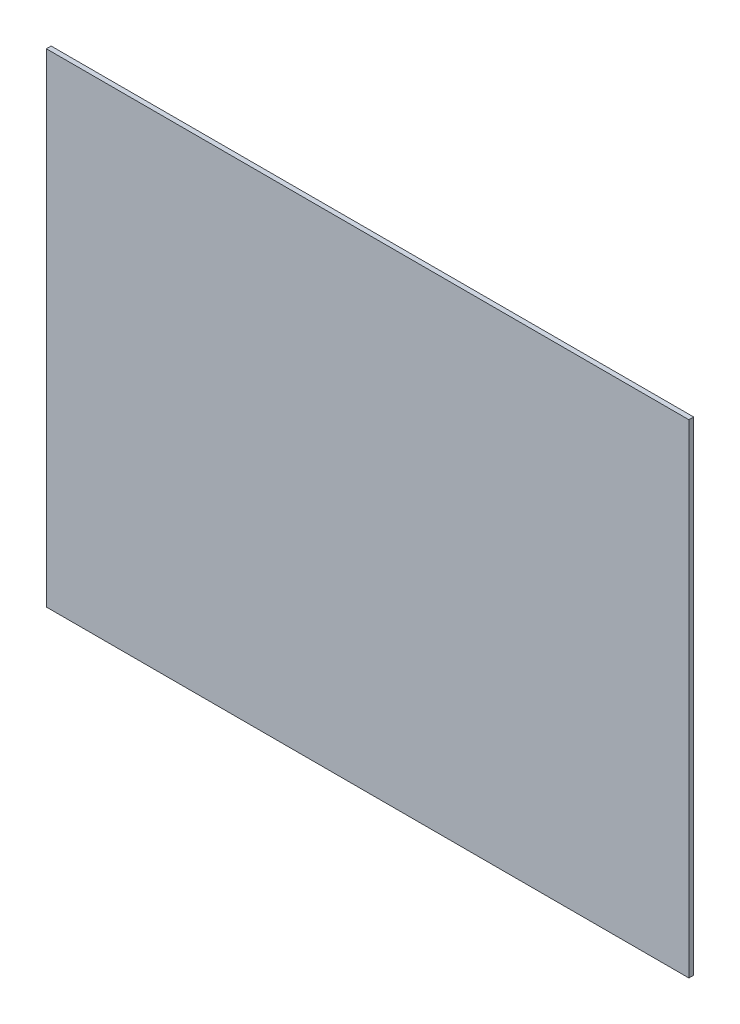
ISO-10303-21;
HEADER;
FILE_DESCRIPTION(('STEP AP214'),'2;1');
FILE_NAME('part.step','',(''),(''),'','','');
FILE_SCHEMA(('AUTOMOTIVE_DESIGN { 1 0 10303 214 1 1 1 1 }'));
ENDSEC;
DATA;
#1=APPLICATION_CONTEXT('core data for automotive mechanical design processes');
#2=APPLICATION_PROTOCOL_DEFINITION('international standard','automotive_design',2000,#1);
#3=PRODUCT_CONTEXT('',#1,'mechanical');
#4=PRODUCT('Part','Part','',(#3));
#5=PRODUCT_RELATED_PRODUCT_CATEGORY('part','',(#4));
#6=PRODUCT_DEFINITION_FORMATION('','',#4);
#7=PRODUCT_DEFINITION_CONTEXT('part definition',#1,'design');
#8=PRODUCT_DEFINITION('design','',#6,#7);
#9=PRODUCT_DEFINITION_SHAPE('','',#8);
#10=(LENGTH_UNIT() NAMED_UNIT(*) SI_UNIT(.MILLI.,.METRE.));
#11=(NAMED_UNIT(*) PLANE_ANGLE_UNIT() SI_UNIT($,.RADIAN.));
#12=(NAMED_UNIT(*) SI_UNIT($,.STERADIAN.) SOLID_ANGLE_UNIT());
#13=UNCERTAINTY_MEASURE_WITH_UNIT(LENGTH_MEASURE(1.E-05),#10,'distance_accuracy_value','');
#14=(GEOMETRIC_REPRESENTATION_CONTEXT(3) GLOBAL_UNCERTAINTY_ASSIGNED_CONTEXT((#13)) GLOBAL_UNIT_ASSIGNED_CONTEXT((#10,
#11,#12)) REPRESENTATION_CONTEXT('',''));
#15=CARTESIAN_POINT('',(0.,0.,0.));
#16=DIRECTION('',(0.,0.,1.));
#17=DIRECTION('',(1.,0.,0.));
#18=AXIS2_PLACEMENT_3D('',#15,#16,#17);
#19=CARTESIAN_POINT('',(202.,152.,3.));
#20=DIRECTION('',(-1.,0.,0.));
#21=DIRECTION('',(0.,-1.,0.));
#22=AXIS2_PLACEMENT_3D('',#19,#20,#21);
#23=PLANE('',#22);
#24=DIRECTION('',(0.,1.,0.));
#25=VECTOR('',#24,1.);
#26=CARTESIAN_POINT('',(202.,152.,0.));
#27=LINE('',#26,#25);
#28=CARTESIAN_POINT('',(202.,-152.,0.));
#29=VERTEX_POINT('',#28);
#30=CARTESIAN_POINT('',(202.,152.,0.));
#31=VERTEX_POINT('',#30);
#32=EDGE_CURVE('E96',#29,#31,#27,.T.);
#33=ORIENTED_EDGE('',*,*,#32,.T.);
#34=DIRECTION('',(0.,0.,-1.));
#35=VECTOR('',#34,1.);
#36=CARTESIAN_POINT('',(202.,152.,3.));
#37=LINE('',#36,#35);
#38=CARTESIAN_POINT('',(202.,152.,3.));
#39=VERTEX_POINT('',#38);
#40=EDGE_CURVE('E11',#39,#31,#37,.T.);
#41=ORIENTED_EDGE('',*,*,#40,.F.);
#42=DIRECTION('',(0.,1.,0.));
#43=VECTOR('',#42,1.);
#44=CARTESIAN_POINT('',(202.,152.,3.));
#45=LINE('',#44,#43);
#46=CARTESIAN_POINT('',(202.,-152.,3.));
#47=VERTEX_POINT('',#46);
#48=EDGE_CURVE('E84',#47,#39,#45,.T.);
#49=ORIENTED_EDGE('',*,*,#48,.F.);
#50=DIRECTION('',(0.,0.,-1.));
#51=VECTOR('',#50,1.);
#52=CARTESIAN_POINT('',(202.,-152.,3.));
#53=LINE('',#52,#51);
#54=EDGE_CURVE('E92',#47,#29,#53,.T.);
#55=ORIENTED_EDGE('',*,*,#54,.T.);
#56=EDGE_LOOP('',(#33,#41,#49,#55));
#57=FACE_BOUND('',#56,.T.);
#58=ADVANCED_FACE('F33',(#57),#23,.F.);
#59=CARTESIAN_POINT('',(-202.,152.,3.));
#60=DIRECTION('',(0.,-1.,0.));
#61=DIRECTION('',(0.,0.,-1.));
#62=AXIS2_PLACEMENT_3D('',#59,#60,#61);
#63=PLANE('',#62);
#64=DIRECTION('',(-1.,0.,0.));
#65=VECTOR('',#64,1.);
#66=CARTESIAN_POINT('',(-202.,152.,0.));
#67=LINE('',#66,#65);
#68=CARTESIAN_POINT('',(-202.,152.,0.));
#69=VERTEX_POINT('',#68);
#70=EDGE_CURVE('E88',#31,#69,#67,.T.);
#71=ORIENTED_EDGE('',*,*,#70,.T.);
#72=DIRECTION('',(0.,0.,-1.));
#73=VECTOR('',#72,1.);
#74=CARTESIAN_POINT('',(-202.,152.,3.));
#75=LINE('',#74,#73);
#76=CARTESIAN_POINT('',(-202.,152.,3.));
#77=VERTEX_POINT('',#76);
#78=EDGE_CURVE('E41',#77,#69,#75,.T.);
#79=ORIENTED_EDGE('',*,*,#78,.F.);
#80=DIRECTION('',(-1.,0.,0.));
#81=VECTOR('',#80,1.);
#82=CARTESIAN_POINT('',(-202.,152.,3.));
#83=LINE('',#82,#81);
#84=EDGE_CURVE('E79',#39,#77,#83,.T.);
#85=ORIENTED_EDGE('',*,*,#84,.F.);
#86=ORIENTED_EDGE('',*,*,#40,.T.);
#87=EDGE_LOOP('',(#71,#79,#85,#86));
#88=FACE_BOUND('',#87,.T.);
#89=ADVANCED_FACE('F87',(#88),#63,.F.);
#90=CARTESIAN_POINT('',(-202.,152.,3.));
#91=DIRECTION('',(1.,0.,0.));
#92=DIRECTION('',(0.,1.,0.));
#93=AXIS2_PLACEMENT_3D('',#90,#91,#92);
#94=PLANE('',#93);
#95=DIRECTION('',(0.,-1.,0.));
#96=VECTOR('',#95,1.);
#97=CARTESIAN_POINT('',(-202.,152.,0.));
#98=LINE('',#97,#96);
#99=CARTESIAN_POINT('',(-202.,-152.,0.));
#100=VERTEX_POINT('',#99);
#101=EDGE_CURVE('E66',#69,#100,#98,.T.);
#102=ORIENTED_EDGE('',*,*,#101,.T.);
#103=DIRECTION('',(0.,0.,-1.));
#104=VECTOR('',#103,1.);
#105=CARTESIAN_POINT('',(-202.,-152.,3.));
#106=LINE('',#105,#104);
#107=CARTESIAN_POINT('',(-202.,-152.,3.));
#108=VERTEX_POINT('',#107);
#109=EDGE_CURVE('E89',#108,#100,#106,.T.);
#110=ORIENTED_EDGE('',*,*,#109,.F.);
#111=DIRECTION('',(0.,-1.,0.));
#112=VECTOR('',#111,1.);
#113=CARTESIAN_POINT('',(-202.,152.,3.));
#114=LINE('',#113,#112);
#115=EDGE_CURVE('E82',#77,#108,#114,.T.);
#116=ORIENTED_EDGE('',*,*,#115,.F.);
#117=ORIENTED_EDGE('',*,*,#78,.T.);
#118=EDGE_LOOP('',(#102,#110,#116,#117));
#119=FACE_BOUND('',#118,.T.);
#120=ADVANCED_FACE('F90',(#119),#94,.F.);
#121=CARTESIAN_POINT('',(-202.,-152.,3.));
#122=DIRECTION('',(0.,1.,0.));
#123=DIRECTION('',(0.,0.,1.));
#124=AXIS2_PLACEMENT_3D('',#121,#122,#123);
#125=PLANE('',#124);
#126=DIRECTION('',(1.,0.,0.));
#127=VECTOR('',#126,1.);
#128=CARTESIAN_POINT('',(-202.,-152.,0.));
#129=LINE('',#128,#127);
#130=EDGE_CURVE('E72',#100,#29,#129,.T.);
#131=ORIENTED_EDGE('',*,*,#130,.T.);
#132=ORIENTED_EDGE('',*,*,#54,.F.);
#133=DIRECTION('',(1.,0.,0.));
#134=VECTOR('',#133,1.);
#135=CARTESIAN_POINT('',(-202.,-152.,3.));
#136=LINE('',#135,#134);
#137=EDGE_CURVE('E49',#108,#47,#136,.T.);
#138=ORIENTED_EDGE('',*,*,#137,.F.);
#139=ORIENTED_EDGE('',*,*,#109,.T.);
#140=EDGE_LOOP('',(#131,#132,#138,#139));
#141=FACE_BOUND('',#140,.T.);
#142=ADVANCED_FACE('F103',(#141),#125,.F.);
#143=CARTESIAN_POINT('',(0.,0.,3.));
#144=DIRECTION('',(0.,0.,1.));
#145=DIRECTION('',(1.,0.,0.));
#146=AXIS2_PLACEMENT_3D('',#143,#144,#145);
#147=PLANE('',#146);
#148=ORIENTED_EDGE('',*,*,#48,.T.);
#149=ORIENTED_EDGE('',*,*,#84,.T.);
#150=ORIENTED_EDGE('',*,*,#115,.T.);
#151=ORIENTED_EDGE('',*,*,#137,.T.);
#152=EDGE_LOOP('',(#148,#149,#150,#151));
#153=FACE_BOUND('',#152,.T.);
#154=ADVANCED_FACE('F80',(#153),#147,.T.);
#155=CARTESIAN_POINT('',(0.,0.,0.));
#156=DIRECTION('',(0.,0.,1.));
#157=DIRECTION('',(1.,0.,0.));
#158=AXIS2_PLACEMENT_3D('',#155,#156,#157);
#159=PLANE('',#158);
#160=ORIENTED_EDGE('',*,*,#32,.F.);
#161=ORIENTED_EDGE('',*,*,#130,.F.);
#162=ORIENTED_EDGE('',*,*,#101,.F.);
#163=ORIENTED_EDGE('',*,*,#70,.F.);
#164=EDGE_LOOP('',(#160,#161,#162,#163));
#165=FACE_BOUND('',#164,.T.);
#166=ADVANCED_FACE('F106',(#165),#159,.F.);
#167=CLOSED_SHELL('',(#58,#89,#120,#142,#154,#166));
#168=MANIFOLD_SOLID_BREP('B2',#167);
#169=ADVANCED_BREP_SHAPE_REPRESENTATION('',(#18,#168),#14);
#170=SHAPE_DEFINITION_REPRESENTATION(#9,#169);
ENDSEC;
END-ISO-10303-21;
